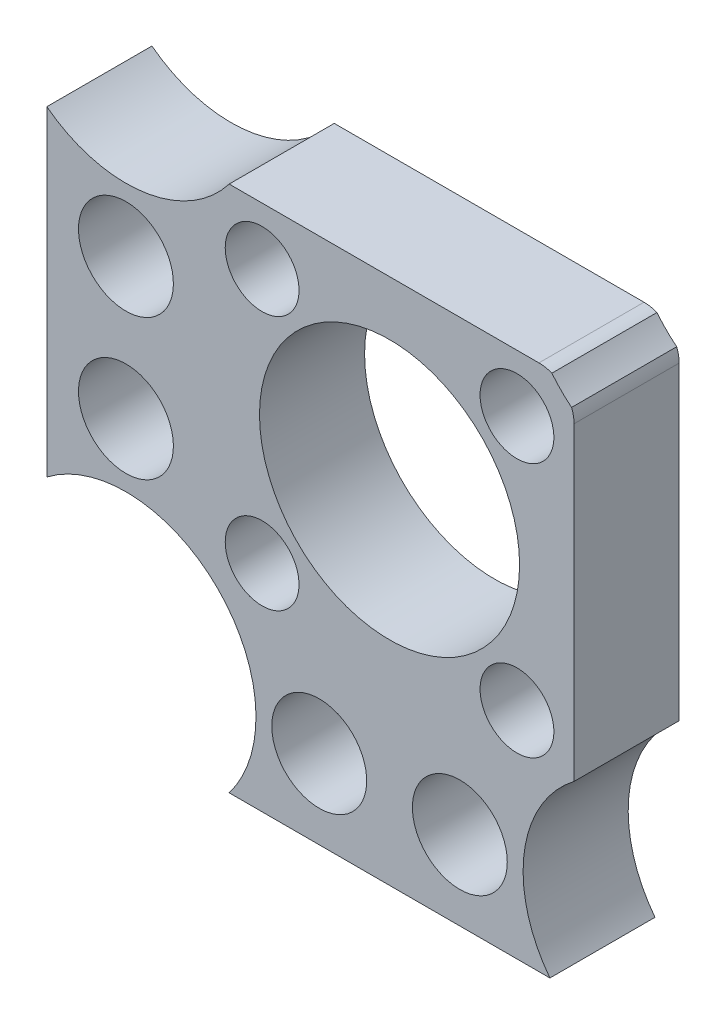
ISO-10303-21;
HEADER;
FILE_DESCRIPTION(('STEP AP214'),'2;1');
FILE_NAME('part.step','',(''),(''),'','','');
FILE_SCHEMA(('AUTOMOTIVE_DESIGN { 1 0 10303 214 1 1 1 1 }'));
ENDSEC;
DATA;
#1=APPLICATION_CONTEXT('core data for automotive mechanical design processes');
#2=APPLICATION_PROTOCOL_DEFINITION('international standard','automotive_design',2000,#1);
#3=PRODUCT_CONTEXT('',#1,'mechanical');
#4=PRODUCT('Part','Part','',(#3));
#5=PRODUCT_RELATED_PRODUCT_CATEGORY('part','',(#4));
#6=PRODUCT_DEFINITION_FORMATION('','',#4);
#7=PRODUCT_DEFINITION_CONTEXT('part definition',#1,'design');
#8=PRODUCT_DEFINITION('design','',#6,#7);
#9=PRODUCT_DEFINITION_SHAPE('','',#8);
#10=(LENGTH_UNIT() NAMED_UNIT(*) SI_UNIT(.MILLI.,.METRE.));
#11=(NAMED_UNIT(*) PLANE_ANGLE_UNIT() SI_UNIT($,.RADIAN.));
#12=(NAMED_UNIT(*) SI_UNIT($,.STERADIAN.) SOLID_ANGLE_UNIT());
#13=UNCERTAINTY_MEASURE_WITH_UNIT(LENGTH_MEASURE(1.E-05),#10,'distance_accuracy_value','');
#14=(GEOMETRIC_REPRESENTATION_CONTEXT(3) GLOBAL_UNCERTAINTY_ASSIGNED_CONTEXT((#13)) GLOBAL_UNIT_ASSIGNED_CONTEXT((#10,
#11,#12)) REPRESENTATION_CONTEXT('',''));
#15=CARTESIAN_POINT('',(0.,0.,0.));
#16=DIRECTION('',(0.,0.,1.));
#17=DIRECTION('',(1.,0.,0.));
#18=AXIS2_PLACEMENT_3D('',#15,#16,#17);
#19=CARTESIAN_POINT('',(8.49999999999999,8.5,-48.4264068711929));
#20=DIRECTION('',(0.,0.,1.));
#21=DIRECTION('',(1.,0.,0.));
#22=AXIS2_PLACEMENT_3D('',#19,#20,#21);
#23=CYLINDRICAL_SURFACE('',#22,2.);
#24=DIRECTION('',(0.,0.,-1.));
#25=VECTOR('',#24,1.);
#26=CARTESIAN_POINT('',(9.23555827157973,10.3598263438049,-0.48));
#27=LINE('',#26,#25);
#28=CARTESIAN_POINT('',(9.23555827157973,10.3598263438049,-5.98));
#29=VERTEX_POINT('',#28);
#30=CARTESIAN_POINT('',(9.23555827157973,10.3598263438049,0.));
#31=VERTEX_POINT('',#30);
#32=EDGE_CURVE('E12',#29,#31,#27,.F.);
#33=ORIENTED_EDGE('',*,*,#32,.F.);
#34=CARTESIAN_POINT('',(8.49999999999999,8.5,-5.98));
#35=DIRECTION('',(0.,0.,-1.));
#36=DIRECTION('',(-1.,0.,0.));
#37=AXIS2_PLACEMENT_3D('',#34,#35,#36);
#38=CIRCLE('',#37,2.);
#39=CARTESIAN_POINT('',(8.49999999999999,10.5,-5.98));
#40=VERTEX_POINT('',#39);
#41=EDGE_CURVE('E125',#40,#29,#38,.T.);
#42=ORIENTED_EDGE('',*,*,#41,.F.);
#43=DIRECTION('',(0.,0.,1.));
#44=VECTOR('',#43,1.);
#45=CARTESIAN_POINT('',(8.49999999999999,10.5,-48.4264068711929));
#46=LINE('',#45,#44);
#47=CARTESIAN_POINT('',(8.5,10.5,0.));
#48=VERTEX_POINT('',#47);
#49=EDGE_CURVE('E141',#48,#40,#46,.F.);
#50=ORIENTED_EDGE('',*,*,#49,.F.);
#51=CARTESIAN_POINT('',(8.49999999999999,8.5,0.));
#52=DIRECTION('',(0.,0.,-1.));
#53=DIRECTION('',(-1.,0.,0.));
#54=AXIS2_PLACEMENT_3D('',#51,#52,#53);
#55=CIRCLE('',#54,2.);
#56=EDGE_CURVE('E147',#31,#48,#55,.F.);
#57=ORIENTED_EDGE('',*,*,#56,.F.);
#58=EDGE_LOOP('',(#33,#42,#50,#57));
#59=FACE_BOUND('',#58,.T.);
#60=ADVANCED_FACE('F40',(#59),#23,.T.);
#61=CARTESIAN_POINT('',(-19.5,10.5,-48.4264068711929));
#62=DIRECTION('',(-1.,0.,0.));
#63=DIRECTION('',(0.,-1.,0.));
#64=AXIS2_PLACEMENT_3D('',#61,#62,#63);
#65=PLANE('',#64);
#66=DIRECTION('',(0.,0.,-1.));
#67=VECTOR('',#66,1.);
#68=CARTESIAN_POINT('',(-19.5,9.12547874290995,5.02));
#69=LINE('',#68,#67);
#70=CARTESIAN_POINT('',(-19.5,9.12547874290995,-5.98));
#71=VERTEX_POINT('',#70);
#72=CARTESIAN_POINT('',(-19.5,9.12547874290995,0.));
#73=VERTEX_POINT('',#72);
#74=EDGE_CURVE('E215',#71,#73,#69,.F.);
#75=ORIENTED_EDGE('',*,*,#74,.F.);
#76=DIRECTION('',(0.,-1.,0.));
#77=VECTOR('',#76,1.);
#78=CARTESIAN_POINT('',(-19.5,10.5,-5.98));
#79=LINE('',#78,#77);
#80=CARTESIAN_POINT('',(-19.5,-9.12547874291019,-5.98));
#81=VERTEX_POINT('',#80);
#82=EDGE_CURVE('E159',#71,#81,#79,.T.);
#83=ORIENTED_EDGE('',*,*,#82,.T.);
#84=DIRECTION('',(0.,0.,-1.));
#85=VECTOR('',#84,1.);
#86=CARTESIAN_POINT('',(-19.5,-9.12547874291019,5.02));
#87=LINE('',#86,#85);
#88=CARTESIAN_POINT('',(-19.5,-9.12547874291019,0.));
#89=VERTEX_POINT('',#88);
#90=EDGE_CURVE('E189',#89,#81,#87,.T.);
#91=ORIENTED_EDGE('',*,*,#90,.F.);
#92=DIRECTION('',(0.,-1.,0.));
#93=VECTOR('',#92,1.);
#94=CARTESIAN_POINT('',(-19.5,10.5,0.));
#95=LINE('',#94,#93);
#96=EDGE_CURVE('E164',#73,#89,#95,.T.);
#97=ORIENTED_EDGE('',*,*,#96,.F.);
#98=EDGE_LOOP('',(#75,#83,#91,#97));
#99=FACE_BOUND('',#98,.T.);
#100=ADVANCED_FACE('F264',(#99),#65,.T.);
#101=CARTESIAN_POINT('',(10.5,10.5,-48.4264068711929));
#102=DIRECTION('',(0.,1.,0.));
#103=DIRECTION('',(-1.,0.,0.));
#104=AXIS2_PLACEMENT_3D('',#101,#102,#103);
#105=PLANE('',#104);
#106=DIRECTION('',(0.,0.,-1.));
#107=VECTOR('',#106,1.);
#108=CARTESIAN_POINT('',(-9.12547874291023,10.5,5.02));
#109=LINE('',#108,#107);
#110=CARTESIAN_POINT('',(-9.12547874291023,10.5,0.));
#111=VERTEX_POINT('',#110);
#112=CARTESIAN_POINT('',(-9.12547874291023,10.5,-5.98));
#113=VERTEX_POINT('',#112);
#114=EDGE_CURVE('E63',#111,#113,#109,.T.);
#115=ORIENTED_EDGE('',*,*,#114,.F.);
#116=DIRECTION('',(-1.,0.,0.));
#117=VECTOR('',#116,1.);
#118=CARTESIAN_POINT('',(10.5,10.5,0.));
#119=LINE('',#118,#117);
#120=EDGE_CURVE('E172',#48,#111,#119,.T.);
#121=ORIENTED_EDGE('',*,*,#120,.F.);
#122=ORIENTED_EDGE('',*,*,#49,.T.);
#123=DIRECTION('',(-1.,0.,0.));
#124=VECTOR('',#123,1.);
#125=CARTESIAN_POINT('',(10.5,10.5,-5.98));
#126=LINE('',#125,#124);
#127=EDGE_CURVE('E156',#40,#113,#126,.T.);
#128=ORIENTED_EDGE('',*,*,#127,.T.);
#129=EDGE_LOOP('',(#115,#121,#122,#128));
#130=FACE_BOUND('',#129,.T.);
#131=ADVANCED_FACE('F270',(#130),#105,.T.);
#132=CARTESIAN_POINT('',(10.5,-19.5,-48.4264068711929));
#133=DIRECTION('',(1.,0.,0.));
#134=DIRECTION('',(0.,1.,0.));
#135=AXIS2_PLACEMENT_3D('',#132,#133,#134);
#136=PLANE('',#135);
#137=DIRECTION('',(0.,0.,-1.));
#138=VECTOR('',#137,1.);
#139=CARTESIAN_POINT('',(10.5,-9.12547874291018,5.02));
#140=LINE('',#139,#138);
#141=CARTESIAN_POINT('',(10.5,-9.12547874291018,-5.98));
#142=VERTEX_POINT('',#141);
#143=CARTESIAN_POINT('',(10.5,-9.12547874291018,0.));
#144=VERTEX_POINT('',#143);
#145=EDGE_CURVE('E209',#142,#144,#140,.F.);
#146=ORIENTED_EDGE('',*,*,#145,.F.);
#147=DIRECTION('',(0.,1.,0.));
#148=VECTOR('',#147,1.);
#149=CARTESIAN_POINT('',(10.5,-19.5,-5.98));
#150=LINE('',#149,#148);
#151=CARTESIAN_POINT('',(10.5,8.5,-5.98));
#152=VERTEX_POINT('',#151);
#153=EDGE_CURVE('E154',#142,#152,#150,.T.);
#154=ORIENTED_EDGE('',*,*,#153,.T.);
#155=DIRECTION('',(0.,0.,1.));
#156=VECTOR('',#155,1.);
#157=CARTESIAN_POINT('',(10.5,8.5,-48.4264068711929));
#158=LINE('',#157,#156);
#159=CARTESIAN_POINT('',(10.5,8.5,0.));
#160=VERTEX_POINT('',#159);
#161=EDGE_CURVE('E140',#152,#160,#158,.T.);
#162=ORIENTED_EDGE('',*,*,#161,.T.);
#163=DIRECTION('',(0.,1.,0.));
#164=VECTOR('',#163,1.);
#165=CARTESIAN_POINT('',(10.5,-19.5,0.));
#166=LINE('',#165,#164);
#167=EDGE_CURVE('E170',#144,#160,#166,.T.);
#168=ORIENTED_EDGE('',*,*,#167,.F.);
#169=EDGE_LOOP('',(#146,#154,#162,#168));
#170=FACE_BOUND('',#169,.T.);
#171=ADVANCED_FACE('F308',(#170),#136,.T.);
#172=CARTESIAN_POINT('',(-10.5,-19.5,-48.4264068711929));
#173=DIRECTION('',(0.,-1.,0.));
#174=DIRECTION('',(0.,0.,-1.));
#175=AXIS2_PLACEMENT_3D('',#172,#173,#174);
#176=PLANE('',#175);
#177=DIRECTION('',(0.,0.,-1.));
#178=VECTOR('',#177,1.);
#179=CARTESIAN_POINT('',(9.12547874291028,-19.5,5.02));
#180=LINE('',#179,#178);
#181=CARTESIAN_POINT('',(9.12547874291028,-19.5,0.));
#182=VERTEX_POINT('',#181);
#183=CARTESIAN_POINT('',(9.12547874291028,-19.5,-5.98));
#184=VERTEX_POINT('',#183);
#185=EDGE_CURVE('E55',#182,#184,#180,.T.);
#186=ORIENTED_EDGE('',*,*,#185,.F.);
#187=DIRECTION('',(1.,0.,0.));
#188=VECTOR('',#187,1.);
#189=CARTESIAN_POINT('',(-10.5,-19.5,0.));
#190=LINE('',#189,#188);
#191=CARTESIAN_POINT('',(-9.12547874291019,-19.5,0.));
#192=VERTEX_POINT('',#191);
#193=EDGE_CURVE('E167',#192,#182,#190,.T.);
#194=ORIENTED_EDGE('',*,*,#193,.F.);
#195=DIRECTION('',(0.,0.,-1.));
#196=VECTOR('',#195,1.);
#197=CARTESIAN_POINT('',(-9.12547874291019,-19.5,5.02));
#198=LINE('',#197,#196);
#199=CARTESIAN_POINT('',(-9.12547874291019,-19.5,-5.98));
#200=VERTEX_POINT('',#199);
#201=EDGE_CURVE('E202',#200,#192,#198,.F.);
#202=ORIENTED_EDGE('',*,*,#201,.F.);
#203=DIRECTION('',(1.,0.,0.));
#204=VECTOR('',#203,1.);
#205=CARTESIAN_POINT('',(-10.5,-19.5,-5.98));
#206=LINE('',#205,#204);
#207=EDGE_CURVE('E150',#200,#184,#206,.T.);
#208=ORIENTED_EDGE('',*,*,#207,.T.);
#209=EDGE_LOOP('',(#186,#194,#202,#208));
#210=FACE_BOUND('',#209,.T.);
#211=ADVANCED_FACE('F306',(#210),#176,.T.);
#212=CARTESIAN_POINT('',(0.,0.,-48.4264068711929));
#213=DIRECTION('',(0.,0.,1.));
#214=DIRECTION('',(1.,0.,0.));
#215=AXIS2_PLACEMENT_3D('',#212,#213,#214);
#216=CYLINDRICAL_SURFACE('',#215,7.4);
#217=CARTESIAN_POINT('',(0.,0.,0.));
#218=DIRECTION('',(0.,0.,1.));
#219=DIRECTION('',(1.,0.,0.));
#220=AXIS2_PLACEMENT_3D('',#217,#218,#219);
#221=CIRCLE('',#220,7.4);
#222=CARTESIAN_POINT('',(7.4,0.,0.));
#223=VERTEX_POINT('',#222);
#224=EDGE_CURVE('E153',#223,#223,#221,.T.);
#225=ORIENTED_EDGE('',*,*,#224,.T.);
#226=EDGE_LOOP('',(#225));
#227=FACE_BOUND('',#226,.T.);
#228=CARTESIAN_POINT('',(0.,0.,-5.98));
#229=DIRECTION('',(0.,0.,-1.));
#230=DIRECTION('',(-1.,0.,0.));
#231=AXIS2_PLACEMENT_3D('',#228,#229,#230);
#232=CIRCLE('',#231,7.4);
#233=CARTESIAN_POINT('',(-7.4,0.,-5.98));
#234=VERTEX_POINT('',#233);
#235=EDGE_CURVE('E149',#234,#234,#232,.F.);
#236=ORIENTED_EDGE('',*,*,#235,.F.);
#237=EDGE_LOOP('',(#236));
#238=FACE_BOUND('',#237,.T.);
#239=ADVANCED_FACE('F305',(#227,#238),#216,.F.);
#240=CARTESIAN_POINT('',(0.,0.,0.));
#241=DIRECTION('',(0.,0.,-1.));
#242=DIRECTION('',(-1.,0.,0.));
#243=AXIS2_PLACEMENT_3D('',#240,#241,#242);
#244=PLANE('',#243);
#245=CARTESIAN_POINT('',(-15.,4.00000000000006,0.));
#246=DIRECTION('',(0.,0.,-1.));
#247=DIRECTION('',(0.,1.,0.));
#248=AXIS2_PLACEMENT_3D('',#245,#246,#247);
#249=CIRCLE('',#248,2.7);
#250=CARTESIAN_POINT('',(-15.,6.70000000000006,0.));
#251=VERTEX_POINT('',#250);
#252=EDGE_CURVE('E245',#251,#251,#249,.T.);
#253=ORIENTED_EDGE('',*,*,#252,.T.);
#254=EDGE_LOOP('',(#253));
#255=FACE_BOUND('',#254,.T.);
#256=CARTESIAN_POINT('',(-15.,-3.99999999999995,0.));
#257=DIRECTION('',(0.,0.,1.));
#258=DIRECTION('',(0.,-1.,0.));
#259=AXIS2_PLACEMENT_3D('',#256,#257,#258);
#260=CIRCLE('',#259,2.7);
#261=CARTESIAN_POINT('',(-15.,-6.69999999999995,0.));
#262=VERTEX_POINT('',#261);
#263=EDGE_CURVE('E236',#262,#262,#260,.T.);
#264=ORIENTED_EDGE('',*,*,#263,.F.);
#265=EDGE_LOOP('',(#264));
#266=FACE_BOUND('',#265,.T.);
#267=CARTESIAN_POINT('',(-4.,-15.,0.));
#268=DIRECTION('',(0.,0.,-1.));
#269=DIRECTION('',(-1.,0.,0.));
#270=AXIS2_PLACEMENT_3D('',#267,#268,#269);
#271=CIRCLE('',#270,2.7);
#272=CARTESIAN_POINT('',(-6.7,-15.,0.));
#273=VERTEX_POINT('',#272);
#274=EDGE_CURVE('E233',#273,#273,#271,.T.);
#275=ORIENTED_EDGE('',*,*,#274,.T.);
#276=EDGE_LOOP('',(#275));
#277=FACE_BOUND('',#276,.T.);
#278=CARTESIAN_POINT('',(4.,-15.,0.));
#279=DIRECTION('',(0.,0.,1.));
#280=DIRECTION('',(1.,0.,0.));
#281=AXIS2_PLACEMENT_3D('',#278,#279,#280);
#282=CIRCLE('',#281,2.7);
#283=CARTESIAN_POINT('',(6.7,-15.,0.));
#284=VERTEX_POINT('',#283);
#285=EDGE_CURVE('E222',#284,#284,#282,.T.);
#286=ORIENTED_EDGE('',*,*,#285,.F.);
#287=EDGE_LOOP('',(#286));
#288=FACE_BOUND('',#287,.T.);
#289=CARTESIAN_POINT('',(7.24999999999998,-7.25000000000002,0.));
#290=DIRECTION('',(0.,0.,-1.));
#291=DIRECTION('',(-1.,0.,0.));
#292=AXIS2_PLACEMENT_3D('',#289,#290,#291);
#293=CIRCLE('',#292,2.1);
#294=CARTESIAN_POINT('',(5.14999999999998,-7.25000000000002,0.));
#295=VERTEX_POINT('',#294);
#296=EDGE_CURVE('E181',#295,#295,#293,.F.);
#297=ORIENTED_EDGE('',*,*,#296,.F.);
#298=EDGE_LOOP('',(#297));
#299=FACE_BOUND('',#298,.T.);
#300=CARTESIAN_POINT('',(-7.24999999999999,-7.25,0.));
#301=DIRECTION('',(0.,0.,-1.));
#302=DIRECTION('',(-1.,0.,0.));
#303=AXIS2_PLACEMENT_3D('',#300,#301,#302);
#304=CIRCLE('',#303,2.1);
#305=CARTESIAN_POINT('',(-9.34999999999999,-7.25,0.));
#306=VERTEX_POINT('',#305);
#307=EDGE_CURVE('E190',#306,#306,#304,.F.);
#308=ORIENTED_EDGE('',*,*,#307,.F.);
#309=EDGE_LOOP('',(#308));
#310=FACE_BOUND('',#309,.T.);
#311=CARTESIAN_POINT('',(-7.24999999999993,7.25000000000007,0.));
#312=DIRECTION('',(0.,0.,-1.));
#313=DIRECTION('',(-1.,0.,0.));
#314=AXIS2_PLACEMENT_3D('',#311,#312,#313);
#315=CIRCLE('',#314,2.1);
#316=CARTESIAN_POINT('',(-9.34999999999993,7.25000000000007,0.));
#317=VERTEX_POINT('',#316);
#318=EDGE_CURVE('E182',#317,#317,#315,.F.);
#319=ORIENTED_EDGE('',*,*,#318,.F.);
#320=EDGE_LOOP('',(#319));
#321=FACE_BOUND('',#320,.T.);
#322=CARTESIAN_POINT('',(7.24999999999999,7.25,0.));
#323=DIRECTION('',(0.,0.,-1.));
#324=DIRECTION('',(-1.,0.,0.));
#325=AXIS2_PLACEMENT_3D('',#322,#323,#324);
#326=CIRCLE('',#325,2.1);
#327=CARTESIAN_POINT('',(5.14999999999999,7.25,0.));
#328=VERTEX_POINT('',#327);
#329=EDGE_CURVE('E161',#328,#328,#326,.F.);
#330=ORIENTED_EDGE('',*,*,#329,.F.);
#331=EDGE_LOOP('',(#330));
#332=FACE_BOUND('',#331,.T.);
#333=ORIENTED_EDGE('',*,*,#224,.F.);
#334=EDGE_LOOP('',(#333));
#335=FACE_BOUND('',#334,.T.);
#336=ORIENTED_EDGE('',*,*,#193,.T.);
#337=CARTESIAN_POINT('',(15.0000000000001,-14.9999999999999,0.));
#338=DIRECTION('',(0.,0.,-1.));
#339=DIRECTION('',(-1.,0.,0.));
#340=AXIS2_PLACEMENT_3D('',#337,#338,#339);
#341=CIRCLE('',#340,7.4);
#342=EDGE_CURVE('E212',#182,#144,#341,.T.);
#343=ORIENTED_EDGE('',*,*,#342,.T.);
#344=ORIENTED_EDGE('',*,*,#167,.T.);
#345=CARTESIAN_POINT('',(10.3598263438049,9.23555827157974,0.));
#346=VERTEX_POINT('',#345);
#347=EDGE_CURVE('E143',#160,#346,#55,.F.);
#348=ORIENTED_EDGE('',*,*,#347,.T.);
#349=CARTESIAN_POINT('',(15.,15.,0.));
#350=DIRECTION('',(0.,0.,-1.));
#351=DIRECTION('',(-1.,0.,0.));
#352=AXIS2_PLACEMENT_3D('',#349,#350,#351);
#353=CIRCLE('',#352,7.4);
#354=EDGE_CURVE('E120',#346,#31,#353,.T.);
#355=ORIENTED_EDGE('',*,*,#354,.T.);
#356=ORIENTED_EDGE('',*,*,#56,.T.);
#357=ORIENTED_EDGE('',*,*,#120,.T.);
#358=CARTESIAN_POINT('',(-15.0000000000002,14.9999999999998,0.));
#359=DIRECTION('',(0.,0.,-1.));
#360=DIRECTION('',(-1.,0.,0.));
#361=AXIS2_PLACEMENT_3D('',#358,#359,#360);
#362=CIRCLE('',#361,7.4);
#363=EDGE_CURVE('E218',#111,#73,#362,.T.);
#364=ORIENTED_EDGE('',*,*,#363,.T.);
#365=ORIENTED_EDGE('',*,*,#96,.T.);
#366=CARTESIAN_POINT('',(-15.,-15.,0.));
#367=DIRECTION('',(0.,0.,-1.));
#368=DIRECTION('',(-1.,0.,0.));
#369=AXIS2_PLACEMENT_3D('',#366,#367,#368);
#370=CIRCLE('',#369,7.4);
#371=EDGE_CURVE('E204',#89,#192,#370,.T.);
#372=ORIENTED_EDGE('',*,*,#371,.T.);
#373=EDGE_LOOP('',(#336,#343,#344,#348,#355,#356,#357,#364,#365,#372));
#374=FACE_BOUND('',#373,.T.);
#375=ADVANCED_FACE('F249',(#255,#266,#277,#288,#299,#310,#321,#332,#335,#374),#244,.F.);
#376=CARTESIAN_POINT('',(-10.5,19.49,-5.98));
#377=DIRECTION('',(0.,0.,-1.));
#378=DIRECTION('',(0.,-1.,0.));
#379=AXIS2_PLACEMENT_3D('',#376,#377,#378);
#380=PLANE('',#379);
#381=CARTESIAN_POINT('',(-15.,4.00000000000006,-5.98));
#382=DIRECTION('',(0.,0.,-1.));
#383=DIRECTION('',(-1.,0.,0.));
#384=AXIS2_PLACEMENT_3D('',#381,#382,#383);
#385=CIRCLE('',#384,2.7);
#386=CARTESIAN_POINT('',(-17.7,4.00000000000006,-5.98));
#387=VERTEX_POINT('',#386);
#388=EDGE_CURVE('E240',#387,#387,#385,.T.);
#389=ORIENTED_EDGE('',*,*,#388,.F.);
#390=EDGE_LOOP('',(#389));
#391=FACE_BOUND('',#390,.T.);
#392=CARTESIAN_POINT('',(-15.,-3.99999999999995,-5.98));
#393=DIRECTION('',(0.,0.,-1.));
#394=DIRECTION('',(-1.,0.,0.));
#395=AXIS2_PLACEMENT_3D('',#392,#393,#394);
#396=CIRCLE('',#395,2.7);
#397=CARTESIAN_POINT('',(-17.7,-3.99999999999995,-5.98));
#398=VERTEX_POINT('',#397);
#399=EDGE_CURVE('E237',#398,#398,#396,.F.);
#400=ORIENTED_EDGE('',*,*,#399,.T.);
#401=EDGE_LOOP('',(#400));
#402=FACE_BOUND('',#401,.T.);
#403=CARTESIAN_POINT('',(-4.,-15.,-5.98));
#404=DIRECTION('',(0.,0.,-1.));
#405=DIRECTION('',(-1.,0.,0.));
#406=AXIS2_PLACEMENT_3D('',#403,#404,#405);
#407=CIRCLE('',#406,2.7);
#408=CARTESIAN_POINT('',(-6.7,-15.,-5.98));
#409=VERTEX_POINT('',#408);
#410=EDGE_CURVE('E228',#409,#409,#407,.T.);
#411=ORIENTED_EDGE('',*,*,#410,.F.);
#412=EDGE_LOOP('',(#411));
#413=FACE_BOUND('',#412,.T.);
#414=CARTESIAN_POINT('',(4.,-15.,-5.98));
#415=DIRECTION('',(0.,0.,-1.));
#416=DIRECTION('',(-1.,0.,0.));
#417=AXIS2_PLACEMENT_3D('',#414,#415,#416);
#418=CIRCLE('',#417,2.7);
#419=CARTESIAN_POINT('',(1.3,-15.,-5.98));
#420=VERTEX_POINT('',#419);
#421=EDGE_CURVE('E225',#420,#420,#418,.F.);
#422=ORIENTED_EDGE('',*,*,#421,.T.);
#423=EDGE_LOOP('',(#422));
#424=FACE_BOUND('',#423,.T.);
#425=CARTESIAN_POINT('',(15.0000000000001,-14.9999999999999,-5.98));
#426=DIRECTION('',(0.,0.,-1.));
#427=DIRECTION('',(0.,-1.,0.));
#428=AXIS2_PLACEMENT_3D('',#425,#426,#427);
#429=CIRCLE('',#428,7.4);
#430=EDGE_CURVE('E136',#184,#142,#429,.T.);
#431=ORIENTED_EDGE('',*,*,#430,.F.);
#432=ORIENTED_EDGE('',*,*,#207,.F.);
#433=CARTESIAN_POINT('',(-15.,-15.,-5.98));
#434=DIRECTION('',(0.,0.,-1.));
#435=DIRECTION('',(-1.,0.,0.));
#436=AXIS2_PLACEMENT_3D('',#433,#434,#435);
#437=CIRCLE('',#436,7.4);
#438=EDGE_CURVE('E207',#81,#200,#437,.T.);
#439=ORIENTED_EDGE('',*,*,#438,.F.);
#440=ORIENTED_EDGE('',*,*,#82,.F.);
#441=CARTESIAN_POINT('',(-15.0000000000002,14.9999999999998,-5.98));
#442=DIRECTION('',(0.,0.,-1.));
#443=DIRECTION('',(0.,1.,0.));
#444=AXIS2_PLACEMENT_3D('',#441,#442,#443);
#445=CIRCLE('',#444,7.4);
#446=EDGE_CURVE('E137',#113,#71,#445,.T.);
#447=ORIENTED_EDGE('',*,*,#446,.F.);
#448=ORIENTED_EDGE('',*,*,#127,.F.);
#449=ORIENTED_EDGE('',*,*,#41,.T.);
#450=CARTESIAN_POINT('',(15.,15.,-5.98));
#451=DIRECTION('',(0.,0.,-1.));
#452=DIRECTION('',(1.,0.,0.));
#453=AXIS2_PLACEMENT_3D('',#450,#451,#452);
#454=CIRCLE('',#453,7.4);
#455=CARTESIAN_POINT('',(10.3598263438049,9.23555827157973,-5.98));
#456=VERTEX_POINT('',#455);
#457=EDGE_CURVE('E117',#456,#29,#454,.T.);
#458=ORIENTED_EDGE('',*,*,#457,.F.);
#459=EDGE_CURVE('E132',#456,#152,#38,.T.);
#460=ORIENTED_EDGE('',*,*,#459,.T.);
#461=ORIENTED_EDGE('',*,*,#153,.F.);
#462=EDGE_LOOP('',(#431,#432,#439,#440,#447,#448,#449,#458,#460,#461));
#463=FACE_BOUND('',#462,.T.);
#464=CARTESIAN_POINT('',(7.24999999999998,-7.25000000000002,-5.98));
#465=DIRECTION('',(0.,0.,-1.));
#466=DIRECTION('',(0.,1.,0.));
#467=AXIS2_PLACEMENT_3D('',#464,#465,#466);
#468=CIRCLE('',#467,2.1);
#469=CARTESIAN_POINT('',(7.24999999999999,-5.15000000000002,-5.98));
#470=VERTEX_POINT('',#469);
#471=EDGE_CURVE('E193',#470,#470,#468,.T.);
#472=ORIENTED_EDGE('',*,*,#471,.F.);
#473=EDGE_LOOP('',(#472));
#474=FACE_BOUND('',#473,.T.);
#475=CARTESIAN_POINT('',(-7.24999999999999,-7.25,-5.98));
#476=DIRECTION('',(0.,0.,-1.));
#477=DIRECTION('',(1.,0.,0.));
#478=AXIS2_PLACEMENT_3D('',#475,#476,#477);
#479=CIRCLE('',#478,2.1);
#480=CARTESIAN_POINT('',(-5.14999999999999,-7.25,-5.98));
#481=VERTEX_POINT('',#480);
#482=EDGE_CURVE('E185',#481,#481,#479,.T.);
#483=ORIENTED_EDGE('',*,*,#482,.F.);
#484=EDGE_LOOP('',(#483));
#485=FACE_BOUND('',#484,.T.);
#486=CARTESIAN_POINT('',(-7.24999999999993,7.25000000000007,-5.98));
#487=DIRECTION('',(0.,0.,-1.));
#488=DIRECTION('',(0.,-1.,0.));
#489=AXIS2_PLACEMENT_3D('',#486,#487,#488);
#490=CIRCLE('',#489,2.1);
#491=CARTESIAN_POINT('',(-7.24999999999995,5.15000000000007,-5.98));
#492=VERTEX_POINT('',#491);
#493=EDGE_CURVE('E186',#492,#492,#490,.T.);
#494=ORIENTED_EDGE('',*,*,#493,.F.);
#495=EDGE_LOOP('',(#494));
#496=FACE_BOUND('',#495,.T.);
#497=CARTESIAN_POINT('',(7.24999999999999,7.25,-5.98));
#498=DIRECTION('',(0.,0.,-1.));
#499=DIRECTION('',(-1.,0.,0.));
#500=AXIS2_PLACEMENT_3D('',#497,#498,#499);
#501=CIRCLE('',#500,2.1);
#502=CARTESIAN_POINT('',(5.14999999999999,7.25,-5.98));
#503=VERTEX_POINT('',#502);
#504=EDGE_CURVE('E178',#503,#503,#501,.T.);
#505=ORIENTED_EDGE('',*,*,#504,.F.);
#506=EDGE_LOOP('',(#505));
#507=FACE_BOUND('',#506,.T.);
#508=ORIENTED_EDGE('',*,*,#235,.T.);
#509=EDGE_LOOP('',(#508));
#510=FACE_BOUND('',#509,.T.);
#511=ADVANCED_FACE('F129',(#391,#402,#413,#424,#463,#474,#485,#496,#507,#510),#380,.T.);
#512=CARTESIAN_POINT('',(7.24999999999999,7.25,0.00100000000000013));
#513=DIRECTION('',(0.,0.,-1.));
#514=DIRECTION('',(-1.,0.,0.));
#515=AXIS2_PLACEMENT_3D('',#512,#513,#514);
#516=CYLINDRICAL_SURFACE('',#515,2.1);
#517=ORIENTED_EDGE('',*,*,#504,.T.);
#518=EDGE_LOOP('',(#517));
#519=FACE_BOUND('',#518,.T.);
#520=ORIENTED_EDGE('',*,*,#329,.T.);
#521=EDGE_LOOP('',(#520));
#522=FACE_BOUND('',#521,.T.);
#523=ADVANCED_FACE('F298',(#519,#522),#516,.F.);
#524=CARTESIAN_POINT('',(-7.24999999999993,7.25000000000007,0.00100000000000013));
#525=DIRECTION('',(0.,0.,-1.));
#526=DIRECTION('',(-1.,0.,0.));
#527=AXIS2_PLACEMENT_3D('',#524,#525,#526);
#528=CYLINDRICAL_SURFACE('',#527,2.1);
#529=ORIENTED_EDGE('',*,*,#493,.T.);
#530=EDGE_LOOP('',(#529));
#531=FACE_BOUND('',#530,.T.);
#532=ORIENTED_EDGE('',*,*,#318,.T.);
#533=EDGE_LOOP('',(#532));
#534=FACE_BOUND('',#533,.T.);
#535=ADVANCED_FACE('F294',(#531,#534),#528,.F.);
#536=CARTESIAN_POINT('',(-7.24999999999999,-7.25,0.00100000000000013));
#537=DIRECTION('',(0.,0.,-1.));
#538=DIRECTION('',(-1.,0.,0.));
#539=AXIS2_PLACEMENT_3D('',#536,#537,#538);
#540=CYLINDRICAL_SURFACE('',#539,2.1);
#541=ORIENTED_EDGE('',*,*,#482,.T.);
#542=EDGE_LOOP('',(#541));
#543=FACE_BOUND('',#542,.T.);
#544=ORIENTED_EDGE('',*,*,#307,.T.);
#545=EDGE_LOOP('',(#544));
#546=FACE_BOUND('',#545,.T.);
#547=ADVANCED_FACE('F287',(#543,#546),#540,.F.);
#548=CARTESIAN_POINT('',(7.24999999999998,-7.25000000000002,0.00100000000000013));
#549=DIRECTION('',(0.,0.,-1.));
#550=DIRECTION('',(-1.,0.,0.));
#551=AXIS2_PLACEMENT_3D('',#548,#549,#550);
#552=CYLINDRICAL_SURFACE('',#551,2.1);
#553=ORIENTED_EDGE('',*,*,#471,.T.);
#554=EDGE_LOOP('',(#553));
#555=FACE_BOUND('',#554,.T.);
#556=ORIENTED_EDGE('',*,*,#296,.T.);
#557=EDGE_LOOP('',(#556));
#558=FACE_BOUND('',#557,.T.);
#559=ADVANCED_FACE('F281',(#555,#558),#552,.F.);
#560=CARTESIAN_POINT('',(-15.,-15.,5.02));
#561=DIRECTION('',(0.,0.,-1.));
#562=DIRECTION('',(-1.,0.,0.));
#563=AXIS2_PLACEMENT_3D('',#560,#561,#562);
#564=CYLINDRICAL_SURFACE('',#563,7.4);
#565=ORIENTED_EDGE('',*,*,#90,.T.);
#566=ORIENTED_EDGE('',*,*,#438,.T.);
#567=ORIENTED_EDGE('',*,*,#201,.T.);
#568=ORIENTED_EDGE('',*,*,#371,.F.);
#569=EDGE_LOOP('',(#565,#566,#567,#568));
#570=FACE_BOUND('',#569,.T.);
#571=ADVANCED_FACE('F274',(#570),#564,.F.);
#572=DIRECTION('',(0.,0.,-1.));
#573=VECTOR('',#572,1.);
#574=CARTESIAN_POINT('',(10.3598263438049,9.23555827157974,-0.48));
#575=LINE('',#574,#573);
#576=EDGE_CURVE('E48',#346,#456,#575,.T.);
#577=ORIENTED_EDGE('',*,*,#576,.F.);
#578=ORIENTED_EDGE('',*,*,#347,.F.);
#579=ORIENTED_EDGE('',*,*,#161,.F.);
#580=ORIENTED_EDGE('',*,*,#459,.F.);
#581=EDGE_LOOP('',(#577,#578,#579,#580));
#582=FACE_BOUND('',#581,.T.);
#583=ADVANCED_FACE('F42',(#582),#23,.T.);
#584=CARTESIAN_POINT('',(15.,15.,5.02));
#585=DIRECTION('',(0.,0.,-1.));
#586=DIRECTION('',(-1.,0.,0.));
#587=AXIS2_PLACEMENT_3D('',#584,#585,#586);
#588=CYLINDRICAL_SURFACE('',#587,7.4);
#589=ORIENTED_EDGE('',*,*,#32,.T.);
#590=ORIENTED_EDGE('',*,*,#354,.F.);
#591=ORIENTED_EDGE('',*,*,#576,.T.);
#592=ORIENTED_EDGE('',*,*,#457,.T.);
#593=EDGE_LOOP('',(#589,#590,#591,#592));
#594=FACE_BOUND('',#593,.T.);
#595=ADVANCED_FACE('F116',(#594),#588,.F.);
#596=CARTESIAN_POINT('',(-15.0000000000002,14.9999999999998,5.02));
#597=DIRECTION('',(0.,0.,-1.));
#598=DIRECTION('',(-1.,0.,0.));
#599=AXIS2_PLACEMENT_3D('',#596,#597,#598);
#600=CYLINDRICAL_SURFACE('',#599,7.4);
#601=ORIENTED_EDGE('',*,*,#74,.T.);
#602=ORIENTED_EDGE('',*,*,#363,.F.);
#603=ORIENTED_EDGE('',*,*,#114,.T.);
#604=ORIENTED_EDGE('',*,*,#446,.T.);
#605=EDGE_LOOP('',(#601,#602,#603,#604));
#606=FACE_BOUND('',#605,.T.);
#607=ADVANCED_FACE('F279',(#606),#600,.F.);
#608=CARTESIAN_POINT('',(15.0000000000001,-14.9999999999999,5.02));
#609=DIRECTION('',(0.,0.,-1.));
#610=DIRECTION('',(-1.,0.,0.));
#611=AXIS2_PLACEMENT_3D('',#608,#609,#610);
#612=CYLINDRICAL_SURFACE('',#611,7.4);
#613=ORIENTED_EDGE('',*,*,#145,.T.);
#614=ORIENTED_EDGE('',*,*,#342,.F.);
#615=ORIENTED_EDGE('',*,*,#185,.T.);
#616=ORIENTED_EDGE('',*,*,#430,.T.);
#617=EDGE_LOOP('',(#613,#614,#615,#616));
#618=FACE_BOUND('',#617,.T.);
#619=ADVANCED_FACE('F333',(#618),#612,.F.);
#620=CARTESIAN_POINT('',(4.,-15.,-5.981));
#621=DIRECTION('',(0.,0.,1.));
#622=DIRECTION('',(1.,0.,0.));
#623=AXIS2_PLACEMENT_3D('',#620,#621,#622);
#624=CYLINDRICAL_SURFACE('',#623,2.7);
#625=ORIENTED_EDGE('',*,*,#421,.F.);
#626=EDGE_LOOP('',(#625));
#627=FACE_BOUND('',#626,.T.);
#628=ORIENTED_EDGE('',*,*,#285,.T.);
#629=EDGE_LOOP('',(#628));
#630=FACE_BOUND('',#629,.T.);
#631=ADVANCED_FACE('F330',(#627,#630),#624,.F.);
#632=CARTESIAN_POINT('',(-4.,-15.,-5.981));
#633=DIRECTION('',(0.,0.,1.));
#634=DIRECTION('',(1.,0.,0.));
#635=AXIS2_PLACEMENT_3D('',#632,#633,#634);
#636=CYLINDRICAL_SURFACE('',#635,2.7);
#637=ORIENTED_EDGE('',*,*,#410,.T.);
#638=EDGE_LOOP('',(#637));
#639=FACE_BOUND('',#638,.T.);
#640=ORIENTED_EDGE('',*,*,#274,.F.);
#641=EDGE_LOOP('',(#640));
#642=FACE_BOUND('',#641,.T.);
#643=ADVANCED_FACE('F260',(#639,#642),#636,.F.);
#644=CARTESIAN_POINT('',(-15.,-3.99999999999995,-5.981));
#645=DIRECTION('',(0.,0.,1.));
#646=DIRECTION('',(1.,0.,0.));
#647=AXIS2_PLACEMENT_3D('',#644,#645,#646);
#648=CYLINDRICAL_SURFACE('',#647,2.7);
#649=ORIENTED_EDGE('',*,*,#399,.F.);
#650=EDGE_LOOP('',(#649));
#651=FACE_BOUND('',#650,.T.);
#652=ORIENTED_EDGE('',*,*,#263,.T.);
#653=EDGE_LOOP('',(#652));
#654=FACE_BOUND('',#653,.T.);
#655=ADVANCED_FACE('F254',(#651,#654),#648,.F.);
#656=CARTESIAN_POINT('',(-15.,4.00000000000006,-5.981));
#657=DIRECTION('',(0.,0.,1.));
#658=DIRECTION('',(1.,0.,0.));
#659=AXIS2_PLACEMENT_3D('',#656,#657,#658);
#660=CYLINDRICAL_SURFACE('',#659,2.7);
#661=ORIENTED_EDGE('',*,*,#388,.T.);
#662=EDGE_LOOP('',(#661));
#663=FACE_BOUND('',#662,.T.);
#664=ORIENTED_EDGE('',*,*,#252,.F.);
#665=EDGE_LOOP('',(#664));
#666=FACE_BOUND('',#665,.T.);
#667=ADVANCED_FACE('F252',(#663,#666),#660,.F.);
#668=CLOSED_SHELL('',(#60,#100,#131,#171,#211,#239,#375,#511,#523,#535,#547,#559,#571,#583,#595,
#607,#619,#631,#643,#655,#667));
#669=MANIFOLD_SOLID_BREP('B2',#668);
#670=ADVANCED_BREP_SHAPE_REPRESENTATION('',(#18,#669),#14);
#671=SHAPE_DEFINITION_REPRESENTATION(#9,#670);
ENDSEC;
END-ISO-10303-21;
